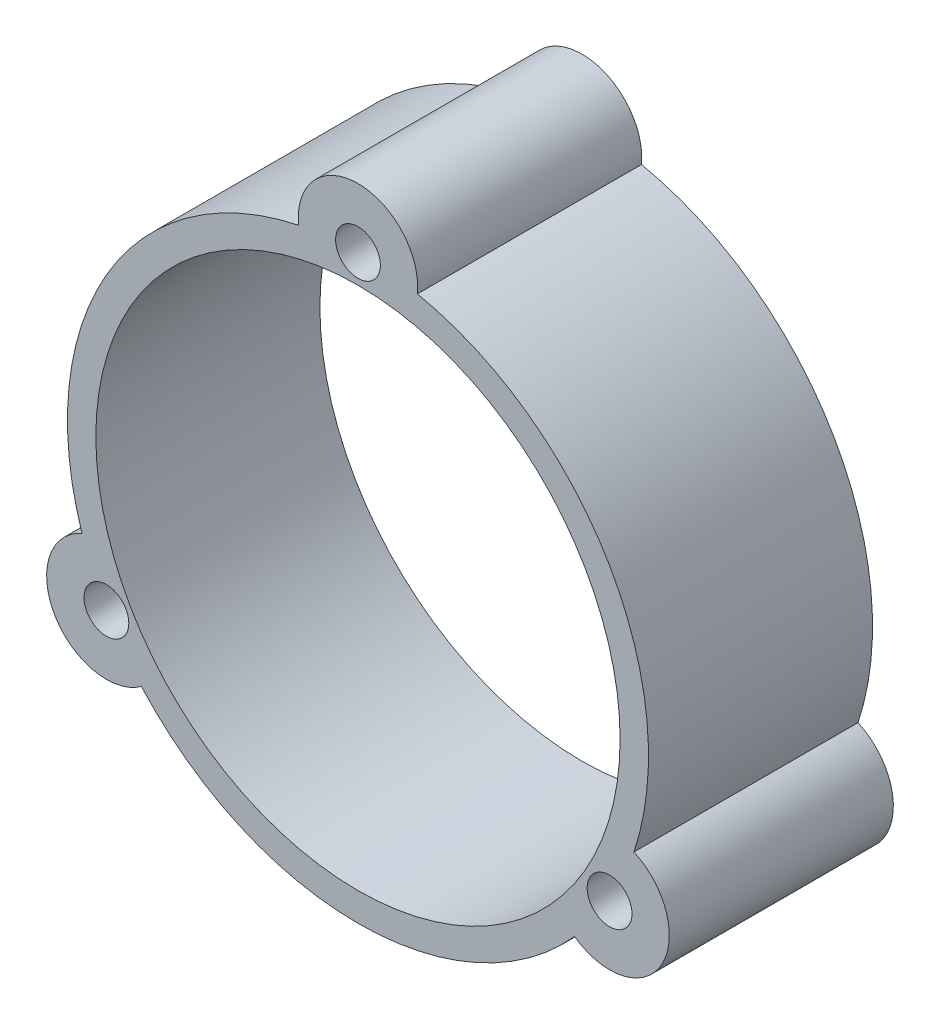
ISO-10303-21;
HEADER;
FILE_DESCRIPTION(('STEP AP214'),'2;1');
FILE_NAME('part.step','',(''),(''),'','','');
FILE_SCHEMA(('AUTOMOTIVE_DESIGN { 1 0 10303 214 1 1 1 1 }'));
ENDSEC;
DATA;
#1=APPLICATION_CONTEXT('core data for automotive mechanical design processes');
#2=APPLICATION_PROTOCOL_DEFINITION('international standard','automotive_design',2000,#1);
#3=PRODUCT_CONTEXT('',#1,'mechanical');
#4=PRODUCT('Part','Part','',(#3));
#5=PRODUCT_RELATED_PRODUCT_CATEGORY('part','',(#4));
#6=PRODUCT_DEFINITION_FORMATION('','',#4);
#7=PRODUCT_DEFINITION_CONTEXT('part definition',#1,'design');
#8=PRODUCT_DEFINITION('design','',#6,#7);
#9=PRODUCT_DEFINITION_SHAPE('','',#8);
#10=(LENGTH_UNIT() NAMED_UNIT(*) SI_UNIT(.MILLI.,.METRE.));
#11=(NAMED_UNIT(*) PLANE_ANGLE_UNIT() SI_UNIT($,.RADIAN.));
#12=(NAMED_UNIT(*) SI_UNIT($,.STERADIAN.) SOLID_ANGLE_UNIT());
#13=UNCERTAINTY_MEASURE_WITH_UNIT(LENGTH_MEASURE(1.E-05),#10,'distance_accuracy_value','');
#14=(GEOMETRIC_REPRESENTATION_CONTEXT(3) GLOBAL_UNCERTAINTY_ASSIGNED_CONTEXT((#13)) GLOBAL_UNIT_ASSIGNED_CONTEXT((#10,
#11,#12)) REPRESENTATION_CONTEXT('',''));
#15=CARTESIAN_POINT('',(0.,0.,0.));
#16=DIRECTION('',(0.,0.,1.));
#17=DIRECTION('',(1.,0.,0.));
#18=AXIS2_PLACEMENT_3D('',#15,#16,#17);
#19=CARTESIAN_POINT('',(0.,0.,15.));
#20=DIRECTION('',(0.,0.,-1.));
#21=DIRECTION('',(-1.,0.,0.));
#22=AXIS2_PLACEMENT_3D('',#19,#20,#21);
#23=CYLINDRICAL_SURFACE('',#22,19.45);
#24=DIRECTION('',(0.,0.,-1.));
#25=VECTOR('',#24,1.);
#26=CARTESIAN_POINT('',(-14.4985899296783,-12.9650834957216,24.9403486300762));
#27=LINE('',#26,#25);
#28=CARTESIAN_POINT('',(-14.4985899296783,-12.9650834957216,15.));
#29=VERTEX_POINT('',#28);
#30=CARTESIAN_POINT('',(-14.4985899296783,-12.9650834957216,0.));
#31=VERTEX_POINT('',#30);
#32=EDGE_CURVE('E141',#29,#31,#27,.T.);
#33=ORIENTED_EDGE('',*,*,#32,.T.);
#34=CARTESIAN_POINT('',(0.,0.,0.));
#35=DIRECTION('',(0.,0.,1.));
#36=DIRECTION('',(1.,0.,0.));
#37=AXIS2_PLACEMENT_3D('',#34,#35,#36);
#38=CIRCLE('',#37,19.45);
#39=CARTESIAN_POINT('',(14.4985899296783,-12.9650834957216,0.));
#40=VERTEX_POINT('',#39);
#41=EDGE_CURVE('E75',#31,#40,#38,.T.);
#42=ORIENTED_EDGE('',*,*,#41,.T.);
#43=DIRECTION('',(0.,0.,-1.));
#44=VECTOR('',#43,1.);
#45=CARTESIAN_POINT('',(14.4985899296783,-12.9650834957216,24.9403486300762));
#46=LINE('',#45,#44);
#47=CARTESIAN_POINT('',(14.4985899296783,-12.9650834957216,15.));
#48=VERTEX_POINT('',#47);
#49=EDGE_CURVE('E99',#48,#40,#46,.T.);
#50=ORIENTED_EDGE('',*,*,#49,.F.);
#51=CARTESIAN_POINT('',(0.,0.,15.));
#52=DIRECTION('',(0.,0.,1.));
#53=DIRECTION('',(1.,0.,0.));
#54=AXIS2_PLACEMENT_3D('',#51,#52,#53);
#55=CIRCLE('',#54,19.45);
#56=EDGE_CURVE('E45',#29,#48,#55,.T.);
#57=ORIENTED_EDGE('',*,*,#56,.F.);
#58=EDGE_LOOP('',(#33,#42,#50,#57));
#59=FACE_BOUND('',#58,.T.);
#60=ADVANCED_FACE('F35',(#59),#23,.T.);
#61=DIRECTION('',(0.,0.,-1.));
#62=VECTOR('',#61,1.);
#63=CARTESIAN_POINT('',(-18.4773866343203,-6.07360545029401,24.9403486300762));
#64=LINE('',#63,#62);
#65=CARTESIAN_POINT('',(-18.4773866343203,-6.07360545029401,15.));
#66=VERTEX_POINT('',#65);
#67=CARTESIAN_POINT('',(-18.4773866343203,-6.07360545029401,0.));
#68=VERTEX_POINT('',#67);
#69=EDGE_CURVE('E143',#66,#68,#64,.T.);
#70=ORIENTED_EDGE('',*,*,#69,.F.);
#71=CARTESIAN_POINT('',(-3.97879670464201,19.0386889460154,15.));
#72=VERTEX_POINT('',#71);
#73=EDGE_CURVE('E11',#72,#66,#55,.T.);
#74=ORIENTED_EDGE('',*,*,#73,.F.);
#75=DIRECTION('',(0.,0.,-1.));
#76=VECTOR('',#75,1.);
#77=CARTESIAN_POINT('',(-3.97879670464201,19.0386889460154,24.1356261534175));
#78=LINE('',#77,#76);
#79=CARTESIAN_POINT('',(-3.97879670464201,19.0386889460154,0.));
#80=VERTEX_POINT('',#79);
#81=EDGE_CURVE('E120',#72,#80,#78,.T.);
#82=ORIENTED_EDGE('',*,*,#81,.T.);
#83=EDGE_CURVE('E39',#80,#68,#38,.T.);
#84=ORIENTED_EDGE('',*,*,#83,.T.);
#85=EDGE_LOOP('',(#70,#74,#82,#84));
#86=FACE_BOUND('',#85,.T.);
#87=ADVANCED_FACE('F164',(#86),#23,.T.);
#88=DIRECTION('',(0.,0.,-1.));
#89=VECTOR('',#88,1.);
#90=CARTESIAN_POINT('',(18.4773866343203,-6.07360545029401,24.9403486300762));
#91=LINE('',#90,#89);
#92=CARTESIAN_POINT('',(18.4773866343203,-6.07360545029401,15.));
#93=VERTEX_POINT('',#92);
#94=CARTESIAN_POINT('',(18.4773866343203,-6.07360545029401,0.));
#95=VERTEX_POINT('',#94);
#96=EDGE_CURVE('E93',#93,#95,#91,.T.);
#97=ORIENTED_EDGE('',*,*,#96,.T.);
#98=CARTESIAN_POINT('',(3.97879670464201,19.0386889460154,0.));
#99=VERTEX_POINT('',#98);
#100=EDGE_CURVE('E55',#95,#99,#38,.T.);
#101=ORIENTED_EDGE('',*,*,#100,.T.);
#102=DIRECTION('',(0.,0.,-1.));
#103=VECTOR('',#102,1.);
#104=CARTESIAN_POINT('',(3.97879670464201,19.0386889460154,24.1356261534175));
#105=LINE('',#104,#103);
#106=CARTESIAN_POINT('',(3.97879670464201,19.0386889460154,15.));
#107=VERTEX_POINT('',#106);
#108=EDGE_CURVE('E102',#107,#99,#105,.T.);
#109=ORIENTED_EDGE('',*,*,#108,.F.);
#110=EDGE_CURVE('E47',#93,#107,#55,.T.);
#111=ORIENTED_EDGE('',*,*,#110,.F.);
#112=EDGE_LOOP('',(#97,#101,#109,#111));
#113=FACE_BOUND('',#112,.T.);
#114=ADVANCED_FACE('F101',(#113),#23,.T.);
#115=CARTESIAN_POINT('',(0.,0.,15.));
#116=DIRECTION('',(0.,0.,-1.));
#117=DIRECTION('',(-1.,0.,0.));
#118=AXIS2_PLACEMENT_3D('',#115,#116,#117);
#119=CYLINDRICAL_SURFACE('',#118,17.55);
#120=CARTESIAN_POINT('',(0.,0.,15.));
#121=DIRECTION('',(0.,0.,1.));
#122=DIRECTION('',(1.,0.,0.));
#123=AXIS2_PLACEMENT_3D('',#120,#121,#122);
#124=CIRCLE('',#123,17.55);
#125=CARTESIAN_POINT('',(17.55,0.,15.));
#126=VERTEX_POINT('',#125);
#127=EDGE_CURVE('E103',#126,#126,#124,.T.);
#128=ORIENTED_EDGE('',*,*,#127,.T.);
#129=EDGE_LOOP('',(#128));
#130=FACE_BOUND('',#129,.T.);
#131=CARTESIAN_POINT('',(0.,0.,0.));
#132=DIRECTION('',(0.,0.,1.));
#133=DIRECTION('',(1.,0.,0.));
#134=AXIS2_PLACEMENT_3D('',#131,#132,#133);
#135=CIRCLE('',#134,17.55);
#136=CARTESIAN_POINT('',(17.55,0.,0.));
#137=VERTEX_POINT('',#136);
#138=EDGE_CURVE('E107',#137,#137,#135,.T.);
#139=ORIENTED_EDGE('',*,*,#138,.F.);
#140=EDGE_LOOP('',(#139));
#141=FACE_BOUND('',#140,.T.);
#142=ADVANCED_FACE('F37',(#130,#141),#119,.F.);
#143=CARTESIAN_POINT('',(0.,0.,15.));
#144=DIRECTION('',(0.,0.,1.));
#145=DIRECTION('',(1.,0.,0.));
#146=AXIS2_PLACEMENT_3D('',#143,#144,#145);
#147=PLANE('',#146);
#148=CARTESIAN_POINT('',(-16.8441941036073,-9.72500000000008,15.));
#149=DIRECTION('',(0.,0.,1.));
#150=DIRECTION('',(1.,0.,0.));
#151=AXIS2_PLACEMENT_3D('',#148,#149,#150);
#152=CIRCLE('',#151,4.);
#153=EDGE_CURVE('E144',#66,#29,#152,.T.);
#154=ORIENTED_EDGE('',*,*,#153,.T.);
#155=ORIENTED_EDGE('',*,*,#56,.T.);
#156=CARTESIAN_POINT('',(16.8441941036073,-9.72500000000008,15.));
#157=DIRECTION('',(0.,0.,1.));
#158=DIRECTION('',(1.,0.,0.));
#159=AXIS2_PLACEMENT_3D('',#156,#157,#158);
#160=CIRCLE('',#159,4.);
#161=EDGE_CURVE('E86',#48,#93,#160,.T.);
#162=ORIENTED_EDGE('',*,*,#161,.T.);
#163=ORIENTED_EDGE('',*,*,#110,.T.);
#164=CARTESIAN_POINT('',(0.,19.45,15.));
#165=DIRECTION('',(0.,0.,1.));
#166=DIRECTION('',(1.,0.,0.));
#167=AXIS2_PLACEMENT_3D('',#164,#165,#166);
#168=CIRCLE('',#167,4.);
#169=EDGE_CURVE('E123',#107,#72,#168,.T.);
#170=ORIENTED_EDGE('',*,*,#169,.T.);
#171=ORIENTED_EDGE('',*,*,#73,.T.);
#172=EDGE_LOOP('',(#154,#155,#162,#163,#170,#171));
#173=FACE_BOUND('',#172,.T.);
#174=CARTESIAN_POINT('',(-16.8441941036073,-9.72500000000008,15.));
#175=DIRECTION('',(0.,0.,1.));
#176=DIRECTION('',(1.,0.,0.));
#177=AXIS2_PLACEMENT_3D('',#174,#175,#176);
#178=CIRCLE('',#177,1.5);
#179=CARTESIAN_POINT('',(-15.3441941036073,-9.72500000000008,15.));
#180=VERTEX_POINT('',#179);
#181=EDGE_CURVE('E128',#180,#180,#178,.T.);
#182=ORIENTED_EDGE('',*,*,#181,.F.);
#183=EDGE_LOOP('',(#182));
#184=FACE_BOUND('',#183,.T.);
#185=CARTESIAN_POINT('',(16.8441941036073,-9.72500000000008,15.));
#186=DIRECTION('',(0.,0.,1.));
#187=DIRECTION('',(1.,0.,0.));
#188=AXIS2_PLACEMENT_3D('',#185,#186,#187);
#189=CIRCLE('',#188,1.5);
#190=CARTESIAN_POINT('',(18.3441941036073,-9.72500000000008,15.));
#191=VERTEX_POINT('',#190);
#192=EDGE_CURVE('E126',#191,#191,#189,.T.);
#193=ORIENTED_EDGE('',*,*,#192,.F.);
#194=EDGE_LOOP('',(#193));
#195=FACE_BOUND('',#194,.T.);
#196=ORIENTED_EDGE('',*,*,#127,.F.);
#197=EDGE_LOOP('',(#196));
#198=FACE_BOUND('',#197,.T.);
#199=CARTESIAN_POINT('',(0.,19.45,15.));
#200=DIRECTION('',(0.,0.,1.));
#201=DIRECTION('',(1.,0.,0.));
#202=AXIS2_PLACEMENT_3D('',#199,#200,#201);
#203=CIRCLE('',#202,1.5);
#204=CARTESIAN_POINT('',(1.5,19.45,15.));
#205=VERTEX_POINT('',#204);
#206=EDGE_CURVE('E109',#205,#205,#203,.T.);
#207=ORIENTED_EDGE('',*,*,#206,.F.);
#208=EDGE_LOOP('',(#207));
#209=FACE_BOUND('',#208,.T.);
#210=ADVANCED_FACE('F89',(#173,#184,#195,#198,#209),#147,.T.);
#211=CARTESIAN_POINT('',(0.,0.,0.));
#212=DIRECTION('',(0.,0.,1.));
#213=DIRECTION('',(1.,0.,0.));
#214=AXIS2_PLACEMENT_3D('',#211,#212,#213);
#215=PLANE('',#214);
#216=ORIENTED_EDGE('',*,*,#41,.F.);
#217=CARTESIAN_POINT('',(-16.8441941036073,-9.72500000000008,0.));
#218=DIRECTION('',(0.,0.,1.));
#219=DIRECTION('',(-0.500000000000004,0.866025403784436,0.));
#220=AXIS2_PLACEMENT_3D('',#217,#218,#219);
#221=CIRCLE('',#220,4.);
#222=EDGE_CURVE('E94',#68,#31,#221,.T.);
#223=ORIENTED_EDGE('',*,*,#222,.F.);
#224=ORIENTED_EDGE('',*,*,#83,.F.);
#225=CARTESIAN_POINT('',(0.,19.45,0.));
#226=DIRECTION('',(0.,0.,1.));
#227=DIRECTION('',(1.,0.,0.));
#228=AXIS2_PLACEMENT_3D('',#225,#226,#227);
#229=CIRCLE('',#228,4.);
#230=EDGE_CURVE('E117',#99,#80,#229,.T.);
#231=ORIENTED_EDGE('',*,*,#230,.F.);
#232=ORIENTED_EDGE('',*,*,#100,.F.);
#233=CARTESIAN_POINT('',(16.8441941036073,-9.72500000000008,0.));
#234=DIRECTION('',(0.,0.,1.));
#235=DIRECTION('',(-0.500000000000004,-0.866025403784436,0.));
#236=AXIS2_PLACEMENT_3D('',#233,#234,#235);
#237=CIRCLE('',#236,4.);
#238=EDGE_CURVE('E98',#40,#95,#237,.T.);
#239=ORIENTED_EDGE('',*,*,#238,.F.);
#240=EDGE_LOOP('',(#216,#223,#224,#231,#232,#239));
#241=FACE_BOUND('',#240,.T.);
#242=CARTESIAN_POINT('',(-16.8441941036073,-9.72500000000008,0.));
#243=DIRECTION('',(0.,0.,1.));
#244=DIRECTION('',(-0.500000000000004,0.866025403784436,0.));
#245=AXIS2_PLACEMENT_3D('',#242,#243,#244);
#246=CIRCLE('',#245,1.5);
#247=CARTESIAN_POINT('',(-17.5941941036073,-8.42596189432343,0.));
#248=VERTEX_POINT('',#247);
#249=EDGE_CURVE('E132',#248,#248,#246,.T.);
#250=ORIENTED_EDGE('',*,*,#249,.T.);
#251=EDGE_LOOP('',(#250));
#252=FACE_BOUND('',#251,.T.);
#253=CARTESIAN_POINT('',(16.8441941036073,-9.72500000000008,0.));
#254=DIRECTION('',(0.,0.,1.));
#255=DIRECTION('',(-0.500000000000004,-0.866025403784436,0.));
#256=AXIS2_PLACEMENT_3D('',#253,#254,#255);
#257=CIRCLE('',#256,1.5);
#258=CARTESIAN_POINT('',(16.0941941036073,-11.0240381056767,0.));
#259=VERTEX_POINT('',#258);
#260=EDGE_CURVE('E131',#259,#259,#257,.T.);
#261=ORIENTED_EDGE('',*,*,#260,.T.);
#262=EDGE_LOOP('',(#261));
#263=FACE_BOUND('',#262,.T.);
#264=CARTESIAN_POINT('',(0.,19.45,0.));
#265=DIRECTION('',(0.,0.,1.));
#266=DIRECTION('',(1.,0.,0.));
#267=AXIS2_PLACEMENT_3D('',#264,#265,#266);
#268=CIRCLE('',#267,1.5);
#269=CARTESIAN_POINT('',(1.5,19.45,0.));
#270=VERTEX_POINT('',#269);
#271=EDGE_CURVE('E113',#270,#270,#268,.T.);
#272=ORIENTED_EDGE('',*,*,#271,.T.);
#273=EDGE_LOOP('',(#272));
#274=FACE_BOUND('',#273,.T.);
#275=ORIENTED_EDGE('',*,*,#138,.T.);
#276=EDGE_LOOP('',(#275));
#277=FACE_BOUND('',#276,.T.);
#278=ADVANCED_FACE('F161',(#241,#252,#263,#274,#277),#215,.F.);
#279=CARTESIAN_POINT('',(0.,19.45,19.2426406871193));
#280=DIRECTION('',(0.,0.,-1.));
#281=DIRECTION('',(-1.,0.,0.));
#282=AXIS2_PLACEMENT_3D('',#279,#280,#281);
#283=CYLINDRICAL_SURFACE('',#282,1.5);
#284=ORIENTED_EDGE('',*,*,#206,.T.);
#285=EDGE_LOOP('',(#284));
#286=FACE_BOUND('',#285,.T.);
#287=ORIENTED_EDGE('',*,*,#271,.F.);
#288=EDGE_LOOP('',(#287));
#289=FACE_BOUND('',#288,.T.);
#290=ADVANCED_FACE('F175',(#286,#289),#283,.F.);
#291=CARTESIAN_POINT('',(0.,19.45,24.1356261534175));
#292=DIRECTION('',(0.,0.,-1.));
#293=DIRECTION('',(-1.,0.,0.));
#294=AXIS2_PLACEMENT_3D('',#291,#292,#293);
#295=CYLINDRICAL_SURFACE('',#294,4.);
#296=ORIENTED_EDGE('',*,*,#169,.F.);
#297=ORIENTED_EDGE('',*,*,#108,.T.);
#298=ORIENTED_EDGE('',*,*,#230,.T.);
#299=ORIENTED_EDGE('',*,*,#81,.F.);
#300=EDGE_LOOP('',(#296,#297,#298,#299));
#301=FACE_BOUND('',#300,.T.);
#302=ADVANCED_FACE('F171',(#301),#295,.T.);
#303=CARTESIAN_POINT('',(-16.8441941036073,-9.72500000000008,19.2426406871193));
#304=DIRECTION('',(0.,0.,-1.));
#305=DIRECTION('',(-1.,0.,0.));
#306=AXIS2_PLACEMENT_3D('',#303,#304,#305);
#307=CYLINDRICAL_SURFACE('',#306,1.5);
#308=ORIENTED_EDGE('',*,*,#181,.T.);
#309=EDGE_LOOP('',(#308));
#310=FACE_BOUND('',#309,.T.);
#311=ORIENTED_EDGE('',*,*,#249,.F.);
#312=EDGE_LOOP('',(#311));
#313=FACE_BOUND('',#312,.T.);
#314=ADVANCED_FACE('F174',(#310,#313),#307,.F.);
#315=CARTESIAN_POINT('',(16.8441941036073,-9.72500000000008,19.2426406871193));
#316=DIRECTION('',(0.,0.,-1.));
#317=DIRECTION('',(-1.,0.,0.));
#318=AXIS2_PLACEMENT_3D('',#315,#316,#317);
#319=CYLINDRICAL_SURFACE('',#318,1.5);
#320=ORIENTED_EDGE('',*,*,#192,.T.);
#321=EDGE_LOOP('',(#320));
#322=FACE_BOUND('',#321,.T.);
#323=ORIENTED_EDGE('',*,*,#260,.F.);
#324=EDGE_LOOP('',(#323));
#325=FACE_BOUND('',#324,.T.);
#326=ADVANCED_FACE('F181',(#322,#325),#319,.F.);
#327=CARTESIAN_POINT('',(16.8441941036073,-9.72500000000008,24.9403486300762));
#328=DIRECTION('',(0.,0.,-1.));
#329=DIRECTION('',(-1.,0.,0.));
#330=AXIS2_PLACEMENT_3D('',#327,#328,#329);
#331=CYLINDRICAL_SURFACE('',#330,4.);
#332=ORIENTED_EDGE('',*,*,#161,.F.);
#333=ORIENTED_EDGE('',*,*,#49,.T.);
#334=ORIENTED_EDGE('',*,*,#238,.T.);
#335=ORIENTED_EDGE('',*,*,#96,.F.);
#336=EDGE_LOOP('',(#332,#333,#334,#335));
#337=FACE_BOUND('',#336,.T.);
#338=ADVANCED_FACE('F96',(#337),#331,.T.);
#339=CARTESIAN_POINT('',(-16.8441941036073,-9.72500000000008,24.9403486300762));
#340=DIRECTION('',(0.,0.,-1.));
#341=DIRECTION('',(-1.,0.,0.));
#342=AXIS2_PLACEMENT_3D('',#339,#340,#341);
#343=CYLINDRICAL_SURFACE('',#342,4.);
#344=ORIENTED_EDGE('',*,*,#153,.F.);
#345=ORIENTED_EDGE('',*,*,#69,.T.);
#346=ORIENTED_EDGE('',*,*,#222,.T.);
#347=ORIENTED_EDGE('',*,*,#32,.F.);
#348=EDGE_LOOP('',(#344,#345,#346,#347));
#349=FACE_BOUND('',#348,.T.);
#350=ADVANCED_FACE('F154',(#349),#343,.T.);
#351=CLOSED_SHELL('',(#60,#87,#114,#142,#210,#278,#290,#302,#314,#326,#338,#350));
#352=MANIFOLD_SOLID_BREP('B2',#351);
#353=ADVANCED_BREP_SHAPE_REPRESENTATION('',(#18,#352),#14);
#354=SHAPE_DEFINITION_REPRESENTATION(#9,#353);
ENDSEC;
END-ISO-10303-21;
